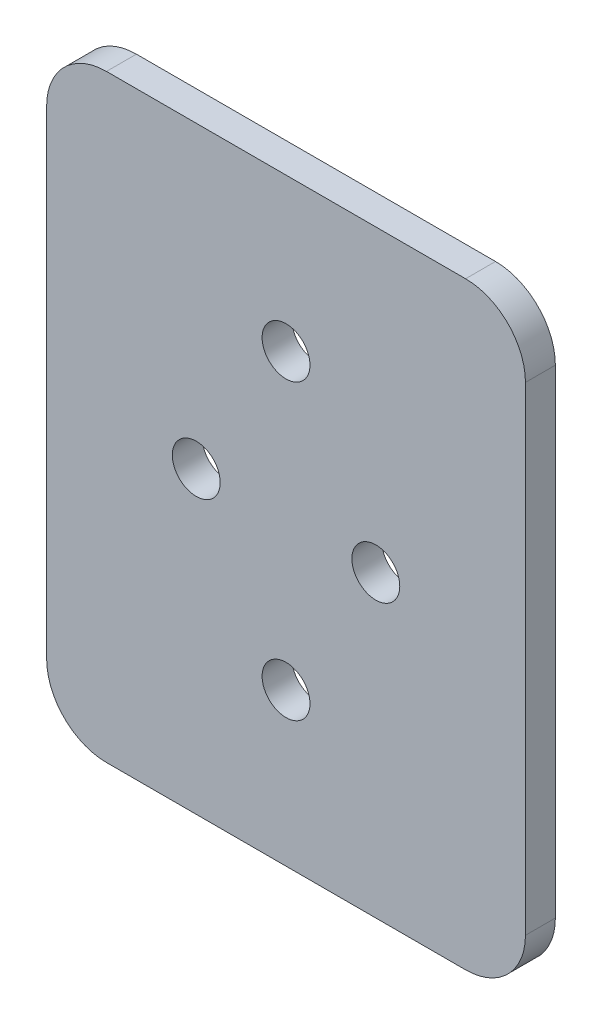
ISO-10303-21;
HEADER;
FILE_DESCRIPTION(('STEP AP214'),'2;1');
FILE_NAME('part.step','',(''),(''),'','','');
FILE_SCHEMA(('AUTOMOTIVE_DESIGN { 1 0 10303 214 1 1 1 1 }'));
ENDSEC;
DATA;
#1=APPLICATION_CONTEXT('core data for automotive mechanical design processes');
#2=APPLICATION_PROTOCOL_DEFINITION('international standard','automotive_design',2000,#1);
#3=PRODUCT_CONTEXT('',#1,'mechanical');
#4=PRODUCT('Part','Part','',(#3));
#5=PRODUCT_RELATED_PRODUCT_CATEGORY('part','',(#4));
#6=PRODUCT_DEFINITION_FORMATION('','',#4);
#7=PRODUCT_DEFINITION_CONTEXT('part definition',#1,'design');
#8=PRODUCT_DEFINITION('design','',#6,#7);
#9=PRODUCT_DEFINITION_SHAPE('','',#8);
#10=(LENGTH_UNIT() NAMED_UNIT(*) SI_UNIT(.MILLI.,.METRE.));
#11=(NAMED_UNIT(*) PLANE_ANGLE_UNIT() SI_UNIT($,.RADIAN.));
#12=(NAMED_UNIT(*) SI_UNIT($,.STERADIAN.) SOLID_ANGLE_UNIT());
#13=UNCERTAINTY_MEASURE_WITH_UNIT(LENGTH_MEASURE(1.E-05),#10,'distance_accuracy_value','');
#14=(GEOMETRIC_REPRESENTATION_CONTEXT(3) GLOBAL_UNCERTAINTY_ASSIGNED_CONTEXT((#13)) GLOBAL_UNIT_ASSIGNED_CONTEXT((#10,
#11,#12)) REPRESENTATION_CONTEXT('',''));
#15=CARTESIAN_POINT('',(0.,0.,0.));
#16=DIRECTION('',(0.,0.,1.));
#17=DIRECTION('',(1.,0.,0.));
#18=AXIS2_PLACEMENT_3D('',#15,#16,#17);
#19=CARTESIAN_POINT('',(-30.,-40.,5.));
#20=DIRECTION('',(0.,0.,1.));
#21=DIRECTION('',(1.,0.,0.));
#22=AXIS2_PLACEMENT_3D('',#19,#20,#21);
#23=PLANE('',#22);
#24=CARTESIAN_POINT('',(-15.,0.,5.));
#25=DIRECTION('',(0.,0.,1.));
#26=DIRECTION('',(1.,0.,0.));
#27=AXIS2_PLACEMENT_3D('',#24,#25,#26);
#28=CIRCLE('',#27,4.);
#29=CARTESIAN_POINT('',(-11.,0.,5.));
#30=VERTEX_POINT('',#29);
#31=EDGE_CURVE('E188',#30,#30,#28,.T.);
#32=ORIENTED_EDGE('',*,*,#31,.F.);
#33=EDGE_LOOP('',(#32));
#34=FACE_BOUND('',#33,.T.);
#35=CARTESIAN_POINT('',(0.,24.5,5.));
#36=DIRECTION('',(0.,0.,1.));
#37=DIRECTION('',(1.,0.,0.));
#38=AXIS2_PLACEMENT_3D('',#35,#36,#37);
#39=CIRCLE('',#38,4.);
#40=CARTESIAN_POINT('',(4.,24.5,5.));
#41=VERTEX_POINT('',#40);
#42=EDGE_CURVE('E134',#41,#41,#39,.T.);
#43=ORIENTED_EDGE('',*,*,#42,.F.);
#44=EDGE_LOOP('',(#43));
#45=FACE_BOUND('',#44,.T.);
#46=CARTESIAN_POINT('',(-30.,-40.,5.));
#47=DIRECTION('',(0.,0.,1.));
#48=DIRECTION('',(1.,0.,0.));
#49=AXIS2_PLACEMENT_3D('',#46,#47,#48);
#50=CIRCLE('',#49,10.);
#51=CARTESIAN_POINT('',(-40.,-40.,5.));
#52=VERTEX_POINT('',#51);
#53=CARTESIAN_POINT('',(-30.,-50.,5.));
#54=VERTEX_POINT('',#53);
#55=EDGE_CURVE('E145',#52,#54,#50,.T.);
#56=ORIENTED_EDGE('',*,*,#55,.T.);
#57=DIRECTION('',(1.,0.,0.));
#58=VECTOR('',#57,1.);
#59=CARTESIAN_POINT('',(30.,-50.,5.));
#60=LINE('',#59,#58);
#61=CARTESIAN_POINT('',(30.,-50.,5.));
#62=VERTEX_POINT('',#61);
#63=EDGE_CURVE('E93',#54,#62,#60,.T.);
#64=ORIENTED_EDGE('',*,*,#63,.T.);
#65=CARTESIAN_POINT('',(30.,-40.,5.));
#66=DIRECTION('',(0.,0.,1.));
#67=DIRECTION('',(1.,0.,0.));
#68=AXIS2_PLACEMENT_3D('',#65,#66,#67);
#69=CIRCLE('',#68,10.);
#70=CARTESIAN_POINT('',(40.,-40.,5.));
#71=VERTEX_POINT('',#70);
#72=EDGE_CURVE('E160',#62,#71,#69,.T.);
#73=ORIENTED_EDGE('',*,*,#72,.T.);
#74=DIRECTION('',(0.,1.,0.));
#75=VECTOR('',#74,1.);
#76=CARTESIAN_POINT('',(40.,-40.,5.));
#77=LINE('',#76,#75);
#78=CARTESIAN_POINT('',(40.,40.,5.));
#79=VERTEX_POINT('',#78);
#80=EDGE_CURVE('E173',#71,#79,#77,.T.);
#81=ORIENTED_EDGE('',*,*,#80,.T.);
#82=CARTESIAN_POINT('',(30.,40.,5.));
#83=DIRECTION('',(0.,0.,1.));
#84=DIRECTION('',(-1.,0.,0.));
#85=AXIS2_PLACEMENT_3D('',#82,#83,#84);
#86=CIRCLE('',#85,10.);
#87=CARTESIAN_POINT('',(30.,50.,5.));
#88=VERTEX_POINT('',#87);
#89=EDGE_CURVE('E112',#79,#88,#86,.T.);
#90=ORIENTED_EDGE('',*,*,#89,.T.);
#91=DIRECTION('',(-1.,0.,0.));
#92=VECTOR('',#91,1.);
#93=CARTESIAN_POINT('',(30.,50.,5.));
#94=LINE('',#93,#92);
#95=CARTESIAN_POINT('',(-30.,50.,5.));
#96=VERTEX_POINT('',#95);
#97=EDGE_CURVE('E106',#88,#96,#94,.T.);
#98=ORIENTED_EDGE('',*,*,#97,.T.);
#99=CARTESIAN_POINT('',(-30.,40.,5.));
#100=DIRECTION('',(0.,0.,1.));
#101=DIRECTION('',(-1.,0.,0.));
#102=AXIS2_PLACEMENT_3D('',#99,#100,#101);
#103=CIRCLE('',#102,10.);
#104=CARTESIAN_POINT('',(-40.,40.,5.));
#105=VERTEX_POINT('',#104);
#106=EDGE_CURVE('E110',#96,#105,#103,.T.);
#107=ORIENTED_EDGE('',*,*,#106,.T.);
#108=DIRECTION('',(0.,-1.,0.));
#109=VECTOR('',#108,1.);
#110=CARTESIAN_POINT('',(-40.,-40.,5.));
#111=LINE('',#110,#109);
#112=EDGE_CURVE('E50',#105,#52,#111,.T.);
#113=ORIENTED_EDGE('',*,*,#112,.T.);
#114=EDGE_LOOP('',(#56,#64,#73,#81,#90,#98,#107,#113));
#115=FACE_BOUND('',#114,.T.);
#116=CARTESIAN_POINT('',(0.,-24.5,5.));
#117=DIRECTION('',(0.,0.,1.));
#118=DIRECTION('',(1.,0.,0.));
#119=AXIS2_PLACEMENT_3D('',#116,#117,#118);
#120=CIRCLE('',#119,4.);
#121=CARTESIAN_POINT('',(4.,-24.5,5.));
#122=VERTEX_POINT('',#121);
#123=EDGE_CURVE('E182',#122,#122,#120,.T.);
#124=ORIENTED_EDGE('',*,*,#123,.F.);
#125=EDGE_LOOP('',(#124));
#126=FACE_BOUND('',#125,.T.);
#127=CARTESIAN_POINT('',(15.,0.,5.));
#128=DIRECTION('',(0.,0.,1.));
#129=DIRECTION('',(1.,0.,0.));
#130=AXIS2_PLACEMENT_3D('',#127,#128,#129);
#131=CIRCLE('',#130,4.);
#132=CARTESIAN_POINT('',(19.,0.,5.));
#133=VERTEX_POINT('',#132);
#134=EDGE_CURVE('E194',#133,#133,#131,.T.);
#135=ORIENTED_EDGE('',*,*,#134,.F.);
#136=EDGE_LOOP('',(#135));
#137=FACE_BOUND('',#136,.T.);
#138=ADVANCED_FACE('F33',(#34,#45,#115,#126,#137),#23,.T.);
#139=CARTESIAN_POINT('',(-30.,-40.,0.));
#140=DIRECTION('',(0.,0.,1.));
#141=DIRECTION('',(1.,0.,0.));
#142=AXIS2_PLACEMENT_3D('',#139,#140,#141);
#143=PLANE('',#142);
#144=CARTESIAN_POINT('',(-30.,-40.,0.));
#145=DIRECTION('',(0.,0.,1.));
#146=DIRECTION('',(1.,0.,0.));
#147=AXIS2_PLACEMENT_3D('',#144,#145,#146);
#148=CIRCLE('',#147,10.);
#149=CARTESIAN_POINT('',(-40.,-40.,0.));
#150=VERTEX_POINT('',#149);
#151=CARTESIAN_POINT('',(-30.,-50.,0.));
#152=VERTEX_POINT('',#151);
#153=EDGE_CURVE('E130',#150,#152,#148,.T.);
#154=ORIENTED_EDGE('',*,*,#153,.F.);
#155=DIRECTION('',(0.,-1.,0.));
#156=VECTOR('',#155,1.);
#157=CARTESIAN_POINT('',(-40.,-40.,0.));
#158=LINE('',#157,#156);
#159=CARTESIAN_POINT('',(-40.,40.,0.));
#160=VERTEX_POINT('',#159);
#161=EDGE_CURVE('E85',#160,#150,#158,.T.);
#162=ORIENTED_EDGE('',*,*,#161,.F.);
#163=CARTESIAN_POINT('',(-30.,40.,0.));
#164=DIRECTION('',(0.,0.,1.));
#165=DIRECTION('',(-1.,0.,0.));
#166=AXIS2_PLACEMENT_3D('',#163,#164,#165);
#167=CIRCLE('',#166,10.);
#168=CARTESIAN_POINT('',(-30.,50.,0.));
#169=VERTEX_POINT('',#168);
#170=EDGE_CURVE('E79',#169,#160,#167,.T.);
#171=ORIENTED_EDGE('',*,*,#170,.F.);
#172=DIRECTION('',(-1.,0.,0.));
#173=VECTOR('',#172,1.);
#174=CARTESIAN_POINT('',(30.,50.,0.));
#175=LINE('',#174,#173);
#176=CARTESIAN_POINT('',(30.,50.,0.));
#177=VERTEX_POINT('',#176);
#178=EDGE_CURVE('E120',#177,#169,#175,.T.);
#179=ORIENTED_EDGE('',*,*,#178,.F.);
#180=CARTESIAN_POINT('',(30.,40.,0.));
#181=DIRECTION('',(0.,0.,1.));
#182=DIRECTION('',(-1.,0.,0.));
#183=AXIS2_PLACEMENT_3D('',#180,#181,#182);
#184=CIRCLE('',#183,10.);
#185=CARTESIAN_POINT('',(40.,40.,0.));
#186=VERTEX_POINT('',#185);
#187=EDGE_CURVE('E140',#186,#177,#184,.T.);
#188=ORIENTED_EDGE('',*,*,#187,.F.);
#189=DIRECTION('',(0.,1.,0.));
#190=VECTOR('',#189,1.);
#191=CARTESIAN_POINT('',(40.,-40.,0.));
#192=LINE('',#191,#190);
#193=CARTESIAN_POINT('',(40.,-40.,0.));
#194=VERTEX_POINT('',#193);
#195=EDGE_CURVE('E138',#194,#186,#192,.T.);
#196=ORIENTED_EDGE('',*,*,#195,.F.);
#197=CARTESIAN_POINT('',(30.,-40.,0.));
#198=DIRECTION('',(0.,0.,1.));
#199=DIRECTION('',(1.,0.,0.));
#200=AXIS2_PLACEMENT_3D('',#197,#198,#199);
#201=CIRCLE('',#200,10.);
#202=CARTESIAN_POINT('',(30.,-50.,0.));
#203=VERTEX_POINT('',#202);
#204=EDGE_CURVE('E136',#203,#194,#201,.T.);
#205=ORIENTED_EDGE('',*,*,#204,.F.);
#206=DIRECTION('',(1.,0.,0.));
#207=VECTOR('',#206,1.);
#208=CARTESIAN_POINT('',(30.,-50.,0.));
#209=LINE('',#208,#207);
#210=EDGE_CURVE('E133',#152,#203,#209,.T.);
#211=ORIENTED_EDGE('',*,*,#210,.F.);
#212=EDGE_LOOP('',(#154,#162,#171,#179,#188,#196,#205,#211));
#213=FACE_BOUND('',#212,.T.);
#214=CARTESIAN_POINT('',(0.,24.5,0.));
#215=DIRECTION('',(0.,0.,1.));
#216=DIRECTION('',(1.,0.,0.));
#217=AXIS2_PLACEMENT_3D('',#214,#215,#216);
#218=CIRCLE('',#217,4.);
#219=CARTESIAN_POINT('',(4.,24.5,0.));
#220=VERTEX_POINT('',#219);
#221=EDGE_CURVE('E179',#220,#220,#218,.T.);
#222=ORIENTED_EDGE('',*,*,#221,.T.);
#223=EDGE_LOOP('',(#222));
#224=FACE_BOUND('',#223,.T.);
#225=CARTESIAN_POINT('',(0.,-24.5,0.));
#226=DIRECTION('',(0.,0.,1.));
#227=DIRECTION('',(1.,0.,0.));
#228=AXIS2_PLACEMENT_3D('',#225,#226,#227);
#229=CIRCLE('',#228,4.);
#230=CARTESIAN_POINT('',(4.,-24.5,0.));
#231=VERTEX_POINT('',#230);
#232=EDGE_CURVE('E185',#231,#231,#229,.T.);
#233=ORIENTED_EDGE('',*,*,#232,.T.);
#234=EDGE_LOOP('',(#233));
#235=FACE_BOUND('',#234,.T.);
#236=CARTESIAN_POINT('',(-15.,0.,0.));
#237=DIRECTION('',(0.,0.,1.));
#238=DIRECTION('',(1.,0.,0.));
#239=AXIS2_PLACEMENT_3D('',#236,#237,#238);
#240=CIRCLE('',#239,4.);
#241=CARTESIAN_POINT('',(-11.,0.,0.));
#242=VERTEX_POINT('',#241);
#243=EDGE_CURVE('E191',#242,#242,#240,.T.);
#244=ORIENTED_EDGE('',*,*,#243,.T.);
#245=EDGE_LOOP('',(#244));
#246=FACE_BOUND('',#245,.T.);
#247=CARTESIAN_POINT('',(15.,0.,0.));
#248=DIRECTION('',(0.,0.,1.));
#249=DIRECTION('',(1.,0.,0.));
#250=AXIS2_PLACEMENT_3D('',#247,#248,#249);
#251=CIRCLE('',#250,4.);
#252=CARTESIAN_POINT('',(19.,0.,0.));
#253=VERTEX_POINT('',#252);
#254=EDGE_CURVE('E197',#253,#253,#251,.T.);
#255=ORIENTED_EDGE('',*,*,#254,.T.);
#256=EDGE_LOOP('',(#255));
#257=FACE_BOUND('',#256,.T.);
#258=ADVANCED_FACE('F164',(#213,#224,#235,#246,#257),#143,.F.);
#259=CARTESIAN_POINT('',(-30.,-40.,5.));
#260=DIRECTION('',(0.,0.,-1.));
#261=DIRECTION('',(-1.,0.,0.));
#262=AXIS2_PLACEMENT_3D('',#259,#260,#261);
#263=CYLINDRICAL_SURFACE('',#262,10.);
#264=ORIENTED_EDGE('',*,*,#153,.T.);
#265=DIRECTION('',(0.,0.,-1.));
#266=VECTOR('',#265,1.);
#267=CARTESIAN_POINT('',(-30.,-50.,5.));
#268=LINE('',#267,#266);
#269=EDGE_CURVE('E11',#54,#152,#268,.T.);
#270=ORIENTED_EDGE('',*,*,#269,.F.);
#271=ORIENTED_EDGE('',*,*,#55,.F.);
#272=DIRECTION('',(0.,0.,-1.));
#273=VECTOR('',#272,1.);
#274=CARTESIAN_POINT('',(-40.,-40.,5.));
#275=LINE('',#274,#273);
#276=EDGE_CURVE('E126',#52,#150,#275,.T.);
#277=ORIENTED_EDGE('',*,*,#276,.T.);
#278=EDGE_LOOP('',(#264,#270,#271,#277));
#279=FACE_BOUND('',#278,.T.);
#280=ADVANCED_FACE('F35',(#279),#263,.T.);
#281=CARTESIAN_POINT('',(30.,-50.,5.));
#282=DIRECTION('',(0.,1.,0.));
#283=DIRECTION('',(-1.,0.,0.));
#284=AXIS2_PLACEMENT_3D('',#281,#282,#283);
#285=PLANE('',#284);
#286=ORIENTED_EDGE('',*,*,#210,.T.);
#287=DIRECTION('',(0.,0.,-1.));
#288=VECTOR('',#287,1.);
#289=CARTESIAN_POINT('',(30.,-50.,5.));
#290=LINE('',#289,#288);
#291=EDGE_CURVE('E42',#62,#203,#290,.T.);
#292=ORIENTED_EDGE('',*,*,#291,.F.);
#293=ORIENTED_EDGE('',*,*,#63,.F.);
#294=ORIENTED_EDGE('',*,*,#269,.T.);
#295=EDGE_LOOP('',(#286,#292,#293,#294));
#296=FACE_BOUND('',#295,.T.);
#297=ADVANCED_FACE('F231',(#296),#285,.F.);
#298=CARTESIAN_POINT('',(30.,-40.,5.));
#299=DIRECTION('',(0.,0.,-1.));
#300=DIRECTION('',(-1.,0.,0.));
#301=AXIS2_PLACEMENT_3D('',#298,#299,#300);
#302=CYLINDRICAL_SURFACE('',#301,10.);
#303=ORIENTED_EDGE('',*,*,#204,.T.);
#304=DIRECTION('',(0.,0.,-1.));
#305=VECTOR('',#304,1.);
#306=CARTESIAN_POINT('',(40.,-40.,5.));
#307=LINE('',#306,#305);
#308=EDGE_CURVE('E152',#71,#194,#307,.T.);
#309=ORIENTED_EDGE('',*,*,#308,.F.);
#310=ORIENTED_EDGE('',*,*,#72,.F.);
#311=ORIENTED_EDGE('',*,*,#291,.T.);
#312=EDGE_LOOP('',(#303,#309,#310,#311));
#313=FACE_BOUND('',#312,.T.);
#314=ADVANCED_FACE('F158',(#313),#302,.T.);
#315=CARTESIAN_POINT('',(40.,-40.,5.));
#316=DIRECTION('',(-1.,0.,0.));
#317=DIRECTION('',(0.,0.,1.));
#318=AXIS2_PLACEMENT_3D('',#315,#316,#317);
#319=PLANE('',#318);
#320=ORIENTED_EDGE('',*,*,#195,.T.);
#321=DIRECTION('',(0.,0.,-1.));
#322=VECTOR('',#321,1.);
#323=CARTESIAN_POINT('',(40.,40.,5.));
#324=LINE('',#323,#322);
#325=EDGE_CURVE('E149',#79,#186,#324,.T.);
#326=ORIENTED_EDGE('',*,*,#325,.F.);
#327=ORIENTED_EDGE('',*,*,#80,.F.);
#328=ORIENTED_EDGE('',*,*,#308,.T.);
#329=EDGE_LOOP('',(#320,#326,#327,#328));
#330=FACE_BOUND('',#329,.T.);
#331=ADVANCED_FACE('F169',(#330),#319,.F.);
#332=CARTESIAN_POINT('',(30.,40.,5.));
#333=DIRECTION('',(0.,0.,-1.));
#334=DIRECTION('',(-1.,0.,0.));
#335=AXIS2_PLACEMENT_3D('',#332,#333,#334);
#336=CYLINDRICAL_SURFACE('',#335,10.);
#337=ORIENTED_EDGE('',*,*,#187,.T.);
#338=DIRECTION('',(0.,0.,-1.));
#339=VECTOR('',#338,1.);
#340=CARTESIAN_POINT('',(30.,50.,5.));
#341=LINE('',#340,#339);
#342=EDGE_CURVE('E121',#88,#177,#341,.T.);
#343=ORIENTED_EDGE('',*,*,#342,.F.);
#344=ORIENTED_EDGE('',*,*,#89,.F.);
#345=ORIENTED_EDGE('',*,*,#325,.T.);
#346=EDGE_LOOP('',(#337,#343,#344,#345));
#347=FACE_BOUND('',#346,.T.);
#348=ADVANCED_FACE('F172',(#347),#336,.T.);
#349=CARTESIAN_POINT('',(30.,50.,5.));
#350=DIRECTION('',(0.,-1.,0.));
#351=DIRECTION('',(0.,0.,-1.));
#352=AXIS2_PLACEMENT_3D('',#349,#350,#351);
#353=PLANE('',#352);
#354=ORIENTED_EDGE('',*,*,#178,.T.);
#355=DIRECTION('',(0.,0.,-1.));
#356=VECTOR('',#355,1.);
#357=CARTESIAN_POINT('',(-30.,50.,5.));
#358=LINE('',#357,#356);
#359=EDGE_CURVE('E117',#96,#169,#358,.T.);
#360=ORIENTED_EDGE('',*,*,#359,.F.);
#361=ORIENTED_EDGE('',*,*,#97,.F.);
#362=ORIENTED_EDGE('',*,*,#342,.T.);
#363=EDGE_LOOP('',(#354,#360,#361,#362));
#364=FACE_BOUND('',#363,.T.);
#365=ADVANCED_FACE('F118',(#364),#353,.F.);
#366=CARTESIAN_POINT('',(-30.,40.,5.));
#367=DIRECTION('',(0.,0.,-1.));
#368=DIRECTION('',(-1.,0.,0.));
#369=AXIS2_PLACEMENT_3D('',#366,#367,#368);
#370=CYLINDRICAL_SURFACE('',#369,10.);
#371=ORIENTED_EDGE('',*,*,#170,.T.);
#372=DIRECTION('',(0.,0.,-1.));
#373=VECTOR('',#372,1.);
#374=CARTESIAN_POINT('',(-40.,40.,5.));
#375=LINE('',#374,#373);
#376=EDGE_CURVE('E122',#105,#160,#375,.T.);
#377=ORIENTED_EDGE('',*,*,#376,.F.);
#378=ORIENTED_EDGE('',*,*,#106,.F.);
#379=ORIENTED_EDGE('',*,*,#359,.T.);
#380=EDGE_LOOP('',(#371,#377,#378,#379));
#381=FACE_BOUND('',#380,.T.);
#382=ADVANCED_FACE('F124',(#381),#370,.T.);
#383=CARTESIAN_POINT('',(-40.,-40.,5.));
#384=DIRECTION('',(1.,0.,0.));
#385=DIRECTION('',(0.,0.,-1.));
#386=AXIS2_PLACEMENT_3D('',#383,#384,#385);
#387=PLANE('',#386);
#388=ORIENTED_EDGE('',*,*,#161,.T.);
#389=ORIENTED_EDGE('',*,*,#276,.F.);
#390=ORIENTED_EDGE('',*,*,#112,.F.);
#391=ORIENTED_EDGE('',*,*,#376,.T.);
#392=EDGE_LOOP('',(#388,#389,#390,#391));
#393=FACE_BOUND('',#392,.T.);
#394=ADVANCED_FACE('F219',(#393),#387,.F.);
#395=CARTESIAN_POINT('',(0.,24.5,5.));
#396=DIRECTION('',(0.,0.,-1.));
#397=DIRECTION('',(-1.,0.,0.));
#398=AXIS2_PLACEMENT_3D('',#395,#396,#397);
#399=CYLINDRICAL_SURFACE('',#398,4.);
#400=ORIENTED_EDGE('',*,*,#42,.T.);
#401=EDGE_LOOP('',(#400));
#402=FACE_BOUND('',#401,.T.);
#403=ORIENTED_EDGE('',*,*,#221,.F.);
#404=EDGE_LOOP('',(#403));
#405=FACE_BOUND('',#404,.T.);
#406=ADVANCED_FACE('F216',(#402,#405),#399,.F.);
#407=CARTESIAN_POINT('',(0.,-24.5,5.));
#408=DIRECTION('',(0.,0.,-1.));
#409=DIRECTION('',(-1.,0.,0.));
#410=AXIS2_PLACEMENT_3D('',#407,#408,#409);
#411=CYLINDRICAL_SURFACE('',#410,4.);
#412=ORIENTED_EDGE('',*,*,#123,.T.);
#413=EDGE_LOOP('',(#412));
#414=FACE_BOUND('',#413,.T.);
#415=ORIENTED_EDGE('',*,*,#232,.F.);
#416=EDGE_LOOP('',(#415));
#417=FACE_BOUND('',#416,.T.);
#418=ADVANCED_FACE('F295',(#414,#417),#411,.F.);
#419=CARTESIAN_POINT('',(-15.,0.,5.));
#420=DIRECTION('',(0.,0.,-1.));
#421=DIRECTION('',(-1.,0.,0.));
#422=AXIS2_PLACEMENT_3D('',#419,#420,#421);
#423=CYLINDRICAL_SURFACE('',#422,4.);
#424=ORIENTED_EDGE('',*,*,#31,.T.);
#425=EDGE_LOOP('',(#424));
#426=FACE_BOUND('',#425,.T.);
#427=ORIENTED_EDGE('',*,*,#243,.F.);
#428=EDGE_LOOP('',(#427));
#429=FACE_BOUND('',#428,.T.);
#430=ADVANCED_FACE('F303',(#426,#429),#423,.F.);
#431=CARTESIAN_POINT('',(15.,0.,5.));
#432=DIRECTION('',(0.,0.,-1.));
#433=DIRECTION('',(-1.,0.,0.));
#434=AXIS2_PLACEMENT_3D('',#431,#432,#433);
#435=CYLINDRICAL_SURFACE('',#434,4.);
#436=ORIENTED_EDGE('',*,*,#134,.T.);
#437=EDGE_LOOP('',(#436));
#438=FACE_BOUND('',#437,.T.);
#439=ORIENTED_EDGE('',*,*,#254,.F.);
#440=EDGE_LOOP('',(#439));
#441=FACE_BOUND('',#440,.T.);
#442=ADVANCED_FACE('F203',(#438,#441),#435,.F.);
#443=CLOSED_SHELL('',(#138,#258,#280,#297,#314,#331,#348,#365,#382,#394,#406,#418,#430,#442));
#444=MANIFOLD_SOLID_BREP('B2',#443);
#445=ADVANCED_BREP_SHAPE_REPRESENTATION('',(#18,#444),#14);
#446=SHAPE_DEFINITION_REPRESENTATION(#9,#445);
ENDSEC;
END-ISO-10303-21;
